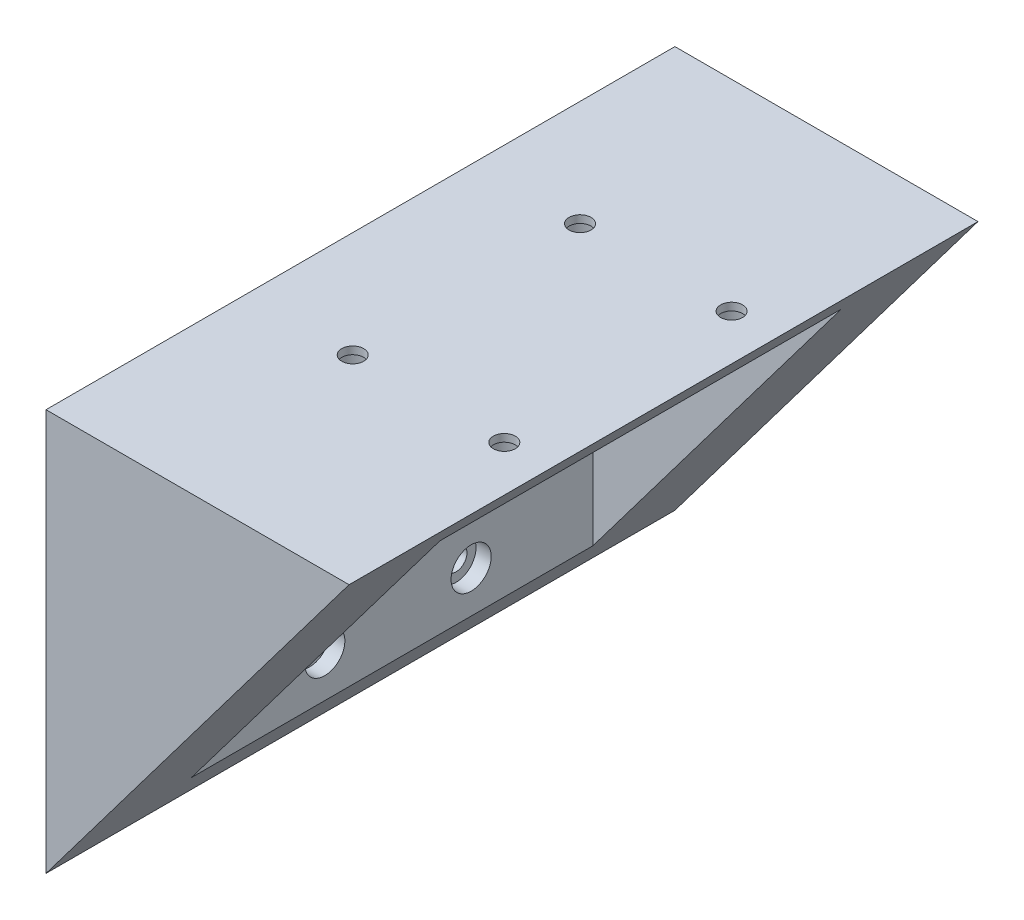
ISO-10303-21;
HEADER;
FILE_DESCRIPTION(('STEP AP214'),'2;1');
FILE_NAME('part.step','',(''),(''),'','','');
FILE_SCHEMA(('AUTOMOTIVE_DESIGN { 1 0 10303 214 1 1 1 1 }'));
ENDSEC;
DATA;
#1=APPLICATION_CONTEXT('core data for automotive mechanical design processes');
#2=APPLICATION_PROTOCOL_DEFINITION('international standard','automotive_design',2000,#1);
#3=PRODUCT_CONTEXT('',#1,'mechanical');
#4=PRODUCT('Part','Part','',(#3));
#5=PRODUCT_RELATED_PRODUCT_CATEGORY('part','',(#4));
#6=PRODUCT_DEFINITION_FORMATION('','',#4);
#7=PRODUCT_DEFINITION_CONTEXT('part definition',#1,'design');
#8=PRODUCT_DEFINITION('design','',#6,#7);
#9=PRODUCT_DEFINITION_SHAPE('','',#8);
#10=(LENGTH_UNIT() NAMED_UNIT(*) SI_UNIT(.MILLI.,.METRE.));
#11=(NAMED_UNIT(*) PLANE_ANGLE_UNIT() SI_UNIT($,.RADIAN.));
#12=(NAMED_UNIT(*) SI_UNIT($,.STERADIAN.) SOLID_ANGLE_UNIT());
#13=UNCERTAINTY_MEASURE_WITH_UNIT(LENGTH_MEASURE(1.E-05),#10,'distance_accuracy_value','');
#14=(GEOMETRIC_REPRESENTATION_CONTEXT(3) GLOBAL_UNCERTAINTY_ASSIGNED_CONTEXT((#13)) GLOBAL_UNIT_ASSIGNED_CONTEXT((#10,
#11,#12)) REPRESENTATION_CONTEXT('',''));
#15=CARTESIAN_POINT('',(0.,0.,0.));
#16=DIRECTION('',(0.,0.,1.));
#17=DIRECTION('',(1.,0.,0.));
#18=AXIS2_PLACEMENT_3D('',#15,#16,#17);
#19=CARTESIAN_POINT('',(33.9811320754717,8.33314479638009,56.5));
#20=DIRECTION('',(0.,-1.,0.));
#21=DIRECTION('',(1.,0.,0.));
#22=AXIS2_PLACEMENT_3D('',#19,#20,#21);
#23=CYLINDRICAL_SURFACE('',#22,1.45);
#24=CARTESIAN_POINT('',(33.9811320754717,2.33314479638009,56.5));
#25=DIRECTION('',(0.,-1.,0.));
#26=DIRECTION('',(0.,0.,-1.));
#27=AXIS2_PLACEMENT_3D('',#24,#25,#26);
#28=CIRCLE('',#27,1.45);
#29=CARTESIAN_POINT('',(33.9811320754717,2.33314479638009,55.05));
#30=VERTEX_POINT('',#29);
#31=EDGE_CURVE('E150',#30,#30,#28,.T.);
#32=ORIENTED_EDGE('',*,*,#31,.F.);
#33=EDGE_LOOP('',(#32));
#34=FACE_BOUND('',#33,.T.);
#35=CARTESIAN_POINT('',(33.9811320754717,1.33314479638009,56.5));
#36=DIRECTION('',(0.,-1.,0.));
#37=DIRECTION('',(1.,0.,0.));
#38=AXIS2_PLACEMENT_3D('',#35,#36,#37);
#39=CIRCLE('',#38,1.45);
#40=CARTESIAN_POINT('',(35.4311320754717,1.33314479638009,56.5));
#41=VERTEX_POINT('',#40);
#42=EDGE_CURVE('E37',#41,#41,#39,.F.);
#43=ORIENTED_EDGE('',*,*,#42,.F.);
#44=EDGE_LOOP('',(#43));
#45=FACE_BOUND('',#44,.T.);
#46=ADVANCED_FACE('F33',(#34,#45),#23,.F.);
#47=CARTESIAN_POINT('',(13.9811320754717,8.33314479638009,56.5));
#48=DIRECTION('',(0.,-1.,0.));
#49=DIRECTION('',(1.,0.,0.));
#50=AXIS2_PLACEMENT_3D('',#47,#48,#49);
#51=CYLINDRICAL_SURFACE('',#50,1.45);
#52=CARTESIAN_POINT('',(13.9811320754717,2.33314479638009,56.5));
#53=DIRECTION('',(0.,-1.,0.));
#54=DIRECTION('',(0.,0.,-1.));
#55=AXIS2_PLACEMENT_3D('',#52,#53,#54);
#56=CIRCLE('',#55,1.45);
#57=CARTESIAN_POINT('',(13.9811320754717,2.33314479638009,55.05));
#58=VERTEX_POINT('',#57);
#59=EDGE_CURVE('E193',#58,#58,#56,.T.);
#60=ORIENTED_EDGE('',*,*,#59,.F.);
#61=EDGE_LOOP('',(#60));
#62=FACE_BOUND('',#61,.T.);
#63=CARTESIAN_POINT('',(13.9811320754717,1.33314479638009,56.5));
#64=DIRECTION('',(0.,-1.,0.));
#65=DIRECTION('',(1.,0.,0.));
#66=AXIS2_PLACEMENT_3D('',#63,#64,#65);
#67=CIRCLE('',#66,1.45);
#68=CARTESIAN_POINT('',(15.4311320754717,1.33314479638009,56.5));
#69=VERTEX_POINT('',#68);
#70=EDGE_CURVE('E157',#69,#69,#67,.F.);
#71=ORIENTED_EDGE('',*,*,#70,.F.);
#72=EDGE_LOOP('',(#71));
#73=FACE_BOUND('',#72,.T.);
#74=ADVANCED_FACE('F234',(#62,#73),#51,.F.);
#75=CARTESIAN_POINT('',(13.9811320754717,8.33314479638009,26.5));
#76=DIRECTION('',(0.,-1.,0.));
#77=DIRECTION('',(1.,0.,0.));
#78=AXIS2_PLACEMENT_3D('',#75,#76,#77);
#79=CYLINDRICAL_SURFACE('',#78,1.45);
#80=CARTESIAN_POINT('',(13.9811320754717,2.33314479638009,26.5));
#81=DIRECTION('',(0.,-1.,0.));
#82=DIRECTION('',(0.,0.,-1.));
#83=AXIS2_PLACEMENT_3D('',#80,#81,#82);
#84=CIRCLE('',#83,1.45);
#85=CARTESIAN_POINT('',(13.9811320754717,2.33314479638009,25.05));
#86=VERTEX_POINT('',#85);
#87=EDGE_CURVE('E196',#86,#86,#84,.T.);
#88=ORIENTED_EDGE('',*,*,#87,.F.);
#89=EDGE_LOOP('',(#88));
#90=FACE_BOUND('',#89,.T.);
#91=CARTESIAN_POINT('',(13.9811320754717,1.33314479638009,26.5));
#92=DIRECTION('',(0.,-1.,0.));
#93=DIRECTION('',(1.,0.,0.));
#94=AXIS2_PLACEMENT_3D('',#91,#92,#93);
#95=CIRCLE('',#94,1.45);
#96=CARTESIAN_POINT('',(15.4311320754717,1.33314479638009,26.5));
#97=VERTEX_POINT('',#96);
#98=EDGE_CURVE('E154',#97,#97,#95,.F.);
#99=ORIENTED_EDGE('',*,*,#98,.F.);
#100=EDGE_LOOP('',(#99));
#101=FACE_BOUND('',#100,.T.);
#102=ADVANCED_FACE('F241',(#90,#101),#79,.F.);
#103=CARTESIAN_POINT('',(33.9811320754717,8.33314479638009,26.5));
#104=DIRECTION('',(0.,-1.,0.));
#105=DIRECTION('',(1.,0.,0.));
#106=AXIS2_PLACEMENT_3D('',#103,#104,#105);
#107=CYLINDRICAL_SURFACE('',#106,1.45);
#108=CARTESIAN_POINT('',(33.9811320754717,2.33314479638009,26.5));
#109=DIRECTION('',(0.,-1.,0.));
#110=DIRECTION('',(0.,0.,-1.));
#111=AXIS2_PLACEMENT_3D('',#108,#109,#110);
#112=CIRCLE('',#111,1.45);
#113=CARTESIAN_POINT('',(33.9811320754717,2.33314479638009,25.05));
#114=VERTEX_POINT('',#113);
#115=EDGE_CURVE('E199',#114,#114,#112,.T.);
#116=ORIENTED_EDGE('',*,*,#115,.F.);
#117=EDGE_LOOP('',(#116));
#118=FACE_BOUND('',#117,.T.);
#119=CARTESIAN_POINT('',(33.9811320754717,1.33314479638009,26.5));
#120=DIRECTION('',(0.,-1.,0.));
#121=DIRECTION('',(1.,0.,0.));
#122=AXIS2_PLACEMENT_3D('',#119,#120,#121);
#123=CIRCLE('',#122,1.45);
#124=CARTESIAN_POINT('',(35.4311320754717,1.33314479638009,26.5));
#125=VERTEX_POINT('',#124);
#126=EDGE_CURVE('E151',#125,#125,#123,.F.);
#127=ORIENTED_EDGE('',*,*,#126,.F.);
#128=EDGE_LOOP('',(#127));
#129=FACE_BOUND('',#128,.T.);
#130=ADVANCED_FACE('F248',(#118,#129),#107,.F.);
#131=CARTESIAN_POINT('',(-5.82641509433961,-28.6868552036199,50.38));
#132=DIRECTION('',(1.,0.,0.));
#133=DIRECTION('',(0.,1.,0.));
#134=AXIS2_PLACEMENT_3D('',#131,#132,#133);
#135=CYLINDRICAL_SURFACE('',#134,1.45);
#136=CARTESIAN_POINT('',(0.,-28.6868552036199,50.38));
#137=DIRECTION('',(1.,0.,0.));
#138=DIRECTION('',(0.,1.,0.));
#139=AXIS2_PLACEMENT_3D('',#136,#137,#138);
#140=CIRCLE('',#139,1.45);
#141=CARTESIAN_POINT('',(0.,-27.2368552036199,50.38));
#142=VERTEX_POINT('',#141);
#143=EDGE_CURVE('E202',#142,#142,#140,.T.);
#144=ORIENTED_EDGE('',*,*,#143,.F.);
#145=EDGE_LOOP('',(#144));
#146=FACE_BOUND('',#145,.T.);
#147=CARTESIAN_POINT('',(2.17358490566039,-28.6868552036199,50.38));
#148=DIRECTION('',(1.,0.,0.));
#149=DIRECTION('',(0.,1.,0.));
#150=AXIS2_PLACEMENT_3D('',#147,#148,#149);
#151=CIRCLE('',#150,1.45);
#152=CARTESIAN_POINT('',(2.17358490566039,-27.2368552036199,50.38));
#153=VERTEX_POINT('',#152);
#154=EDGE_CURVE('E147',#153,#153,#151,.F.);
#155=ORIENTED_EDGE('',*,*,#154,.F.);
#156=EDGE_LOOP('',(#155));
#157=FACE_BOUND('',#156,.T.);
#158=ADVANCED_FACE('F254',(#146,#157),#135,.F.);
#159=CARTESIAN_POINT('',(-5.82641509433961,-39.6368552036199,50.38));
#160=DIRECTION('',(1.,0.,0.));
#161=DIRECTION('',(0.,1.,0.));
#162=AXIS2_PLACEMENT_3D('',#159,#160,#161);
#163=CYLINDRICAL_SURFACE('',#162,1.45);
#164=CARTESIAN_POINT('',(0.,-39.6368552036199,50.38));
#165=DIRECTION('',(1.,0.,0.));
#166=DIRECTION('',(0.,1.,0.));
#167=AXIS2_PLACEMENT_3D('',#164,#165,#166);
#168=CIRCLE('',#167,1.45);
#169=CARTESIAN_POINT('',(0.,-38.1868552036199,50.38));
#170=VERTEX_POINT('',#169);
#171=EDGE_CURVE('E205',#170,#170,#168,.T.);
#172=ORIENTED_EDGE('',*,*,#171,.F.);
#173=EDGE_LOOP('',(#172));
#174=FACE_BOUND('',#173,.T.);
#175=CARTESIAN_POINT('',(2.17358490566039,-39.6368552036199,50.38));
#176=DIRECTION('',(1.,0.,0.));
#177=DIRECTION('',(0.,1.,0.));
#178=AXIS2_PLACEMENT_3D('',#175,#176,#177);
#179=CIRCLE('',#178,1.45);
#180=CARTESIAN_POINT('',(2.17358490566039,-38.1868552036199,50.38));
#181=VERTEX_POINT('',#180);
#182=EDGE_CURVE('E144',#181,#181,#179,.F.);
#183=ORIENTED_EDGE('',*,*,#182,.F.);
#184=EDGE_LOOP('',(#183));
#185=FACE_BOUND('',#184,.T.);
#186=ADVANCED_FACE('F250',(#174,#185),#163,.F.);
#187=CARTESIAN_POINT('',(-5.82641509433961,-39.6368552036199,31.0685809376953));
#188=DIRECTION('',(1.,0.,0.));
#189=DIRECTION('',(0.,1.,0.));
#190=AXIS2_PLACEMENT_3D('',#187,#188,#189);
#191=CYLINDRICAL_SURFACE('',#190,1.45);
#192=CARTESIAN_POINT('',(0.,-39.6368552036199,31.0685809376953));
#193=DIRECTION('',(1.,0.,0.));
#194=DIRECTION('',(0.,1.,0.));
#195=AXIS2_PLACEMENT_3D('',#192,#193,#194);
#196=CIRCLE('',#195,1.45);
#197=CARTESIAN_POINT('',(0.,-38.1868552036199,31.0685809376953));
#198=VERTEX_POINT('',#197);
#199=EDGE_CURVE('E208',#198,#198,#196,.T.);
#200=ORIENTED_EDGE('',*,*,#199,.F.);
#201=EDGE_LOOP('',(#200));
#202=FACE_BOUND('',#201,.T.);
#203=CARTESIAN_POINT('',(2.17358490566039,-39.6368552036199,31.0685809376953));
#204=DIRECTION('',(1.,0.,0.));
#205=DIRECTION('',(0.,1.,0.));
#206=AXIS2_PLACEMENT_3D('',#203,#204,#205);
#207=CIRCLE('',#206,1.45);
#208=CARTESIAN_POINT('',(2.17358490566039,-38.1868552036199,31.0685809376953));
#209=VERTEX_POINT('',#208);
#210=EDGE_CURVE('E140',#209,#209,#207,.F.);
#211=ORIENTED_EDGE('',*,*,#210,.F.);
#212=EDGE_LOOP('',(#211));
#213=FACE_BOUND('',#212,.T.);
#214=ADVANCED_FACE('F253',(#202,#213),#191,.F.);
#215=CARTESIAN_POINT('',(-5.82641509433961,-28.6868552036199,31.0685809376953));
#216=DIRECTION('',(1.,0.,0.));
#217=DIRECTION('',(0.,1.,0.));
#218=AXIS2_PLACEMENT_3D('',#215,#216,#217);
#219=CYLINDRICAL_SURFACE('',#218,1.45);
#220=CARTESIAN_POINT('',(0.,-28.6868552036199,31.0685809376953));
#221=DIRECTION('',(1.,0.,0.));
#222=DIRECTION('',(0.,1.,0.));
#223=AXIS2_PLACEMENT_3D('',#220,#221,#222);
#224=CIRCLE('',#223,1.45);
#225=CARTESIAN_POINT('',(0.,-27.2368552036199,31.0685809376953));
#226=VERTEX_POINT('',#225);
#227=EDGE_CURVE('E211',#226,#226,#224,.T.);
#228=ORIENTED_EDGE('',*,*,#227,.F.);
#229=EDGE_LOOP('',(#228));
#230=FACE_BOUND('',#229,.T.);
#231=CARTESIAN_POINT('',(2.17358490566039,-28.6868552036199,31.0685809376953));
#232=DIRECTION('',(1.,0.,0.));
#233=DIRECTION('',(0.,1.,0.));
#234=AXIS2_PLACEMENT_3D('',#231,#232,#233);
#235=CIRCLE('',#234,1.45);
#236=CARTESIAN_POINT('',(2.17358490566039,-27.2368552036199,31.0685809376953));
#237=VERTEX_POINT('',#236);
#238=EDGE_CURVE('E137',#237,#237,#235,.F.);
#239=ORIENTED_EDGE('',*,*,#238,.F.);
#240=EDGE_LOOP('',(#239));
#241=FACE_BOUND('',#240,.T.);
#242=ADVANCED_FACE('F258',(#230,#241),#219,.F.);
#243=CARTESIAN_POINT('',(40.,2.33314479638009,83.));
#244=DIRECTION('',(-0.798189150333231,0.602406905911872,0.));
#245=DIRECTION('',(-0.602406905911872,-0.798189150333231,0.));
#246=AXIS2_PLACEMENT_3D('',#243,#244,#245);
#247=PLANE('',#246);
#248=DIRECTION('',(0.602406905911872,0.798189150333231,0.));
#249=VECTOR('',#248,1.);
#250=CARTESIAN_POINT('',(40.,2.33314479638009,0.));
#251=LINE('',#250,#249);
#252=CARTESIAN_POINT('',(0.,-50.6668552036199,0.));
#253=VERTEX_POINT('',#252);
#254=CARTESIAN_POINT('',(40.,2.33314479638009,0.));
#255=VERTEX_POINT('',#254);
#256=EDGE_CURVE('E76',#253,#255,#251,.T.);
#257=ORIENTED_EDGE('',*,*,#256,.T.);
#258=DIRECTION('',(0.,0.,-1.));
#259=VECTOR('',#258,1.);
#260=CARTESIAN_POINT('',(40.,2.33314479638009,83.));
#261=LINE('',#260,#259);
#262=CARTESIAN_POINT('',(40.,2.33314479638009,83.));
#263=VERTEX_POINT('',#262);
#264=EDGE_CURVE('E128',#263,#255,#261,.T.);
#265=ORIENTED_EDGE('',*,*,#264,.F.);
#266=DIRECTION('',(0.602406905911872,0.798189150333231,0.));
#267=VECTOR('',#266,1.);
#268=CARTESIAN_POINT('',(40.,2.33314479638009,83.));
#269=LINE('',#268,#267);
#270=CARTESIAN_POINT('',(0.,-50.6668552036199,83.));
#271=VERTEX_POINT('',#270);
#272=EDGE_CURVE('E59',#271,#263,#269,.T.);
#273=ORIENTED_EDGE('',*,*,#272,.F.);
#274=DIRECTION('',(0.,0.,-1.));
#275=VECTOR('',#274,1.);
#276=CARTESIAN_POINT('',(0.,-50.6668552036199,83.));
#277=LINE('',#276,#275);
#278=EDGE_CURVE('E42',#271,#253,#277,.T.);
#279=ORIENTED_EDGE('',*,*,#278,.T.);
#280=EDGE_LOOP('',(#257,#265,#273,#279));
#281=FACE_BOUND('',#280,.T.);
#282=DIRECTION('',(0.602406905911872,0.798189150333231,0.));
#283=VECTOR('',#282,1.);
#284=CARTESIAN_POINT('',(4.17358490566039,-45.1368552036199,15.));
#285=LINE('',#284,#283);
#286=CARTESIAN_POINT('',(4.17358490566039,-45.1368552036199,15.));
#287=VERTEX_POINT('',#286);
#288=CARTESIAN_POINT('',(36.9811320754717,-1.66685520361991,15.));
#289=VERTEX_POINT('',#288);
#290=EDGE_CURVE('E108',#287,#289,#285,.T.);
#291=ORIENTED_EDGE('',*,*,#290,.F.);
#292=DIRECTION('',(0.,0.,1.));
#293=VECTOR('',#292,1.);
#294=CARTESIAN_POINT('',(4.17358490566039,-45.1368552036199,15.));
#295=LINE('',#294,#293);
#296=CARTESIAN_POINT('',(4.17358490566039,-45.1368552036199,68.));
#297=VERTEX_POINT('',#296);
#298=EDGE_CURVE('E119',#287,#297,#295,.T.);
#299=ORIENTED_EDGE('',*,*,#298,.T.);
#300=DIRECTION('',(0.602406905911872,0.798189150333231,0.));
#301=VECTOR('',#300,1.);
#302=CARTESIAN_POINT('',(4.17358490566039,-45.1368552036199,68.));
#303=LINE('',#302,#301);
#304=CARTESIAN_POINT('',(36.9811320754717,-1.66685520361991,68.));
#305=VERTEX_POINT('',#304);
#306=EDGE_CURVE('E117',#297,#305,#303,.T.);
#307=ORIENTED_EDGE('',*,*,#306,.T.);
#308=DIRECTION('',(0.,0.,1.));
#309=VECTOR('',#308,1.);
#310=CARTESIAN_POINT('',(36.9811320754717,-1.66685520361991,15.));
#311=LINE('',#310,#309);
#312=EDGE_CURVE('E101',#289,#305,#311,.T.);
#313=ORIENTED_EDGE('',*,*,#312,.F.);
#314=EDGE_LOOP('',(#291,#299,#307,#313));
#315=FACE_BOUND('',#314,.T.);
#316=ADVANCED_FACE('F116',(#281,#315),#247,.F.);
#317=CARTESIAN_POINT('',(0.,2.33314479638009,83.));
#318=DIRECTION('',(0.,-1.,0.));
#319=DIRECTION('',(0.,0.,-1.));
#320=AXIS2_PLACEMENT_3D('',#317,#318,#319);
#321=PLANE('',#320);
#322=ORIENTED_EDGE('',*,*,#115,.T.);
#323=EDGE_LOOP('',(#322));
#324=FACE_BOUND('',#323,.T.);
#325=ORIENTED_EDGE('',*,*,#87,.T.);
#326=EDGE_LOOP('',(#325));
#327=FACE_BOUND('',#326,.T.);
#328=ORIENTED_EDGE('',*,*,#59,.T.);
#329=EDGE_LOOP('',(#328));
#330=FACE_BOUND('',#329,.T.);
#331=ORIENTED_EDGE('',*,*,#31,.T.);
#332=EDGE_LOOP('',(#331));
#333=FACE_BOUND('',#332,.T.);
#334=DIRECTION('',(-1.,0.,0.));
#335=VECTOR('',#334,1.);
#336=CARTESIAN_POINT('',(0.,2.33314479638009,0.));
#337=LINE('',#336,#335);
#338=CARTESIAN_POINT('',(0.,2.33314479638009,0.));
#339=VERTEX_POINT('',#338);
#340=EDGE_CURVE('E129',#255,#339,#337,.T.);
#341=ORIENTED_EDGE('',*,*,#340,.T.);
#342=DIRECTION('',(0.,0.,-1.));
#343=VECTOR('',#342,1.);
#344=CARTESIAN_POINT('',(0.,2.33314479638009,83.));
#345=LINE('',#344,#343);
#346=CARTESIAN_POINT('',(0.,2.33314479638009,83.));
#347=VERTEX_POINT('',#346);
#348=EDGE_CURVE('E11',#347,#339,#345,.T.);
#349=ORIENTED_EDGE('',*,*,#348,.F.);
#350=DIRECTION('',(-1.,0.,0.));
#351=VECTOR('',#350,1.);
#352=CARTESIAN_POINT('',(0.,2.33314479638009,83.));
#353=LINE('',#352,#351);
#354=EDGE_CURVE('E124',#263,#347,#353,.T.);
#355=ORIENTED_EDGE('',*,*,#354,.F.);
#356=ORIENTED_EDGE('',*,*,#264,.T.);
#357=EDGE_LOOP('',(#341,#349,#355,#356));
#358=FACE_BOUND('',#357,.T.);
#359=ADVANCED_FACE('F35',(#324,#327,#330,#333,#358),#321,.F.);
#360=CARTESIAN_POINT('',(0.,2.33314479638009,83.));
#361=DIRECTION('',(1.,0.,0.));
#362=DIRECTION('',(0.,1.,0.));
#363=AXIS2_PLACEMENT_3D('',#360,#361,#362);
#364=PLANE('',#363);
#365=ORIENTED_EDGE('',*,*,#227,.T.);
#366=EDGE_LOOP('',(#365));
#367=FACE_BOUND('',#366,.T.);
#368=ORIENTED_EDGE('',*,*,#199,.T.);
#369=EDGE_LOOP('',(#368));
#370=FACE_BOUND('',#369,.T.);
#371=ORIENTED_EDGE('',*,*,#171,.T.);
#372=EDGE_LOOP('',(#371));
#373=FACE_BOUND('',#372,.T.);
#374=ORIENTED_EDGE('',*,*,#143,.T.);
#375=EDGE_LOOP('',(#374));
#376=FACE_BOUND('',#375,.T.);
#377=DIRECTION('',(0.,-1.,0.));
#378=VECTOR('',#377,1.);
#379=CARTESIAN_POINT('',(0.,2.33314479638009,0.));
#380=LINE('',#379,#378);
#381=EDGE_CURVE('E132',#339,#253,#380,.T.);
#382=ORIENTED_EDGE('',*,*,#381,.T.);
#383=ORIENTED_EDGE('',*,*,#278,.F.);
#384=DIRECTION('',(0.,-1.,0.));
#385=VECTOR('',#384,1.);
#386=CARTESIAN_POINT('',(0.,2.33314479638009,83.));
#387=LINE('',#386,#385);
#388=EDGE_CURVE('E81',#347,#271,#387,.T.);
#389=ORIENTED_EDGE('',*,*,#388,.F.);
#390=ORIENTED_EDGE('',*,*,#348,.T.);
#391=EDGE_LOOP('',(#382,#383,#389,#390));
#392=FACE_BOUND('',#391,.T.);
#393=ADVANCED_FACE('F368',(#367,#370,#373,#376,#392),#364,.F.);
#394=CARTESIAN_POINT('',(0.,0.,83.));
#395=DIRECTION('',(0.,0.,-1.));
#396=DIRECTION('',(-1.,0.,0.));
#397=AXIS2_PLACEMENT_3D('',#394,#395,#396);
#398=PLANE('',#397);
#399=ORIENTED_EDGE('',*,*,#354,.T.);
#400=ORIENTED_EDGE('',*,*,#388,.T.);
#401=ORIENTED_EDGE('',*,*,#272,.T.);
#402=EDGE_LOOP('',(#399,#400,#401));
#403=FACE_BOUND('',#402,.T.);
#404=ADVANCED_FACE('F362',(#403),#398,.F.);
#405=CARTESIAN_POINT('',(0.,0.,0.));
#406=DIRECTION('',(0.,0.,-1.));
#407=DIRECTION('',(-1.,0.,0.));
#408=AXIS2_PLACEMENT_3D('',#405,#406,#407);
#409=PLANE('',#408);
#410=ORIENTED_EDGE('',*,*,#340,.F.);
#411=ORIENTED_EDGE('',*,*,#256,.F.);
#412=ORIENTED_EDGE('',*,*,#381,.F.);
#413=EDGE_LOOP('',(#410,#411,#412));
#414=FACE_BOUND('',#413,.T.);
#415=ADVANCED_FACE('F350',(#414),#409,.T.);
#416=CARTESIAN_POINT('',(4.17358490566038,-1.66685520361991,15.));
#417=DIRECTION('',(-1.,0.,0.));
#418=DIRECTION('',(0.,-1.,0.));
#419=AXIS2_PLACEMENT_3D('',#416,#417,#418);
#420=PLANE('',#419);
#421=CARTESIAN_POINT('',(4.17358490566039,-28.6868552036199,31.0685809376953));
#422=DIRECTION('',(1.,0.,0.));
#423=DIRECTION('',(0.,1.,0.));
#424=AXIS2_PLACEMENT_3D('',#421,#422,#423);
#425=CIRCLE('',#424,2.65);
#426=CARTESIAN_POINT('',(4.17358490566039,-26.0368552036199,31.0685809376953));
#427=VERTEX_POINT('',#426);
#428=EDGE_CURVE('E179',#427,#427,#425,.T.);
#429=ORIENTED_EDGE('',*,*,#428,.F.);
#430=EDGE_LOOP('',(#429));
#431=FACE_BOUND('',#430,.T.);
#432=CARTESIAN_POINT('',(4.17358490566039,-39.6368552036199,50.38));
#433=DIRECTION('',(1.,0.,0.));
#434=DIRECTION('',(0.,1.,0.));
#435=AXIS2_PLACEMENT_3D('',#432,#433,#434);
#436=CIRCLE('',#435,2.65);
#437=CARTESIAN_POINT('',(4.17358490566039,-36.9868552036199,50.38));
#438=VERTEX_POINT('',#437);
#439=EDGE_CURVE('E171',#438,#438,#436,.T.);
#440=ORIENTED_EDGE('',*,*,#439,.F.);
#441=EDGE_LOOP('',(#440));
#442=FACE_BOUND('',#441,.T.);
#443=CARTESIAN_POINT('',(4.17358490566039,-39.6368552036199,31.0685809376953));
#444=DIRECTION('',(1.,0.,0.));
#445=DIRECTION('',(0.,1.,0.));
#446=AXIS2_PLACEMENT_3D('',#443,#444,#445);
#447=CIRCLE('',#446,2.65);
#448=CARTESIAN_POINT('',(4.17358490566039,-36.9868552036199,31.0685809376953));
#449=VERTEX_POINT('',#448);
#450=EDGE_CURVE('E162',#449,#449,#447,.T.);
#451=ORIENTED_EDGE('',*,*,#450,.F.);
#452=EDGE_LOOP('',(#451));
#453=FACE_BOUND('',#452,.T.);
#454=CARTESIAN_POINT('',(4.17358490566039,-28.6868552036199,50.38));
#455=DIRECTION('',(1.,0.,0.));
#456=DIRECTION('',(0.,1.,0.));
#457=AXIS2_PLACEMENT_3D('',#454,#455,#456);
#458=CIRCLE('',#457,2.65);
#459=CARTESIAN_POINT('',(4.17358490566039,-26.0368552036199,50.38));
#460=VERTEX_POINT('',#459);
#461=EDGE_CURVE('E178',#460,#460,#458,.T.);
#462=ORIENTED_EDGE('',*,*,#461,.F.);
#463=EDGE_LOOP('',(#462));
#464=FACE_BOUND('',#463,.T.);
#465=DIRECTION('',(0.,-1.,0.));
#466=VECTOR('',#465,1.);
#467=CARTESIAN_POINT('',(4.17358490566038,-1.66685520361991,68.));
#468=LINE('',#467,#466);
#469=CARTESIAN_POINT('',(4.17358490566038,-1.66685520361991,68.));
#470=VERTEX_POINT('',#469);
#471=EDGE_CURVE('E114',#470,#297,#468,.T.);
#472=ORIENTED_EDGE('',*,*,#471,.T.);
#473=ORIENTED_EDGE('',*,*,#298,.F.);
#474=DIRECTION('',(0.,-1.,0.));
#475=VECTOR('',#474,1.);
#476=CARTESIAN_POINT('',(4.17358490566038,-1.66685520361991,15.));
#477=LINE('',#476,#475);
#478=CARTESIAN_POINT('',(4.17358490566038,-1.66685520361991,15.));
#479=VERTEX_POINT('',#478);
#480=EDGE_CURVE('E107',#479,#287,#477,.T.);
#481=ORIENTED_EDGE('',*,*,#480,.F.);
#482=DIRECTION('',(0.,0.,1.));
#483=VECTOR('',#482,1.);
#484=CARTESIAN_POINT('',(4.17358490566038,-1.66685520361991,15.));
#485=LINE('',#484,#483);
#486=EDGE_CURVE('E103',#479,#470,#485,.T.);
#487=ORIENTED_EDGE('',*,*,#486,.T.);
#488=EDGE_LOOP('',(#472,#473,#481,#487));
#489=FACE_BOUND('',#488,.T.);
#490=ADVANCED_FACE('F218',(#431,#442,#453,#464,#489),#420,.F.);
#491=CARTESIAN_POINT('',(36.9811320754717,-1.66685520361991,15.));
#492=DIRECTION('',(0.,1.,0.));
#493=DIRECTION('',(-1.,0.,0.));
#494=AXIS2_PLACEMENT_3D('',#491,#492,#493);
#495=PLANE('',#494);
#496=CARTESIAN_POINT('',(33.9811320754717,-1.66685520361991,56.5));
#497=DIRECTION('',(0.,-1.,0.));
#498=DIRECTION('',(1.,0.,0.));
#499=AXIS2_PLACEMENT_3D('',#496,#497,#498);
#500=CIRCLE('',#499,2.8);
#501=CARTESIAN_POINT('',(36.7811320754717,-1.66685520361991,56.5));
#502=VERTEX_POINT('',#501);
#503=EDGE_CURVE('E419',#502,#502,#500,.T.);
#504=ORIENTED_EDGE('',*,*,#503,.F.);
#505=EDGE_LOOP('',(#504));
#506=FACE_BOUND('',#505,.T.);
#507=CARTESIAN_POINT('',(13.9811320754717,-1.66685520361991,26.5));
#508=DIRECTION('',(0.,-1.,0.));
#509=DIRECTION('',(1.,0.,0.));
#510=AXIS2_PLACEMENT_3D('',#507,#508,#509);
#511=CIRCLE('',#510,2.8);
#512=CARTESIAN_POINT('',(16.7811320754717,-1.66685520361991,26.5));
#513=VERTEX_POINT('',#512);
#514=EDGE_CURVE('E430',#513,#513,#511,.T.);
#515=ORIENTED_EDGE('',*,*,#514,.F.);
#516=EDGE_LOOP('',(#515));
#517=FACE_BOUND('',#516,.T.);
#518=CARTESIAN_POINT('',(33.9811320754717,-1.66685520361991,26.5));
#519=DIRECTION('',(0.,-1.,0.));
#520=DIRECTION('',(1.,0.,0.));
#521=AXIS2_PLACEMENT_3D('',#518,#519,#520);
#522=CIRCLE('',#521,2.8);
#523=CARTESIAN_POINT('',(36.7811320754717,-1.66685520361991,26.5));
#524=VERTEX_POINT('',#523);
#525=EDGE_CURVE('E426',#524,#524,#522,.T.);
#526=ORIENTED_EDGE('',*,*,#525,.F.);
#527=EDGE_LOOP('',(#526));
#528=FACE_BOUND('',#527,.T.);
#529=CARTESIAN_POINT('',(13.9811320754717,-1.66685520361991,56.5));
#530=DIRECTION('',(0.,-1.,0.));
#531=DIRECTION('',(1.,0.,0.));
#532=AXIS2_PLACEMENT_3D('',#529,#530,#531);
#533=CIRCLE('',#532,2.8);
#534=CARTESIAN_POINT('',(16.7811320754717,-1.66685520361991,56.5));
#535=VERTEX_POINT('',#534);
#536=EDGE_CURVE('E418',#535,#535,#533,.T.);
#537=ORIENTED_EDGE('',*,*,#536,.F.);
#538=EDGE_LOOP('',(#537));
#539=FACE_BOUND('',#538,.T.);
#540=DIRECTION('',(-1.,0.,0.));
#541=VECTOR('',#540,1.);
#542=CARTESIAN_POINT('',(36.9811320754717,-1.66685520361991,68.));
#543=LINE('',#542,#541);
#544=EDGE_CURVE('E50',#305,#470,#543,.T.);
#545=ORIENTED_EDGE('',*,*,#544,.T.);
#546=ORIENTED_EDGE('',*,*,#486,.F.);
#547=DIRECTION('',(-1.,0.,0.));
#548=VECTOR('',#547,1.);
#549=CARTESIAN_POINT('',(36.9811320754717,-1.66685520361991,15.));
#550=LINE('',#549,#548);
#551=EDGE_CURVE('E97',#289,#479,#550,.T.);
#552=ORIENTED_EDGE('',*,*,#551,.F.);
#553=ORIENTED_EDGE('',*,*,#312,.T.);
#554=EDGE_LOOP('',(#545,#546,#552,#553));
#555=FACE_BOUND('',#554,.T.);
#556=ADVANCED_FACE('F99',(#506,#517,#528,#539,#555),#495,.F.);
#557=CARTESIAN_POINT('',(0.,0.,15.));
#558=DIRECTION('',(0.,0.,1.));
#559=DIRECTION('',(1.,0.,0.));
#560=AXIS2_PLACEMENT_3D('',#557,#558,#559);
#561=PLANE('',#560);
#562=ORIENTED_EDGE('',*,*,#290,.T.);
#563=ORIENTED_EDGE('',*,*,#551,.T.);
#564=ORIENTED_EDGE('',*,*,#480,.T.);
#565=EDGE_LOOP('',(#562,#563,#564));
#566=FACE_BOUND('',#565,.T.);
#567=ADVANCED_FACE('F111',(#566),#561,.T.);
#568=CARTESIAN_POINT('',(0.,0.,68.));
#569=DIRECTION('',(0.,0.,1.));
#570=DIRECTION('',(1.,0.,0.));
#571=AXIS2_PLACEMENT_3D('',#568,#569,#570);
#572=PLANE('',#571);
#573=ORIENTED_EDGE('',*,*,#306,.F.);
#574=ORIENTED_EDGE('',*,*,#471,.F.);
#575=ORIENTED_EDGE('',*,*,#544,.F.);
#576=EDGE_LOOP('',(#573,#574,#575));
#577=FACE_BOUND('',#576,.T.);
#578=ADVANCED_FACE('F219',(#577),#572,.F.);
#579=CARTESIAN_POINT('',(2.17358490566039,-28.6868552036199,31.0685809376953));
#580=DIRECTION('',(1.,0.,0.));
#581=DIRECTION('',(0.,1.,0.));
#582=AXIS2_PLACEMENT_3D('',#579,#580,#581);
#583=PLANE('',#582);
#584=CARTESIAN_POINT('',(2.17358490566039,-28.6868552036199,31.0685809376953));
#585=DIRECTION('',(1.,0.,0.));
#586=DIRECTION('',(0.,1.,0.));
#587=AXIS2_PLACEMENT_3D('',#584,#585,#586);
#588=CIRCLE('',#587,2.65);
#589=CARTESIAN_POINT('',(2.17358490566039,-26.0368552036199,31.0685809376953));
#590=VERTEX_POINT('',#589);
#591=EDGE_CURVE('E175',#590,#590,#588,.T.);
#592=ORIENTED_EDGE('',*,*,#591,.T.);
#593=EDGE_LOOP('',(#592));
#594=FACE_BOUND('',#593,.T.);
#595=ORIENTED_EDGE('',*,*,#238,.T.);
#596=EDGE_LOOP('',(#595));
#597=FACE_BOUND('',#596,.T.);
#598=ADVANCED_FACE('F221',(#594,#597),#583,.T.);
#599=CARTESIAN_POINT('',(2.17358490566039,-28.6868552036199,31.0685809376953));
#600=DIRECTION('',(1.,0.,0.));
#601=DIRECTION('',(0.,1.,0.));
#602=AXIS2_PLACEMENT_3D('',#599,#600,#601);
#603=CYLINDRICAL_SURFACE('',#602,2.65);
#604=ORIENTED_EDGE('',*,*,#591,.F.);
#605=EDGE_LOOP('',(#604));
#606=FACE_BOUND('',#605,.T.);
#607=ORIENTED_EDGE('',*,*,#428,.T.);
#608=EDGE_LOOP('',(#607));
#609=FACE_BOUND('',#608,.T.);
#610=ADVANCED_FACE('F228',(#606,#609),#603,.F.);
#611=CARTESIAN_POINT('',(2.17358490566039,-39.6368552036199,31.0685809376953));
#612=DIRECTION('',(1.,0.,0.));
#613=DIRECTION('',(0.,1.,0.));
#614=AXIS2_PLACEMENT_3D('',#611,#612,#613);
#615=PLANE('',#614);
#616=CARTESIAN_POINT('',(2.17358490566039,-39.6368552036199,31.0685809376953));
#617=DIRECTION('',(1.,0.,0.));
#618=DIRECTION('',(0.,1.,0.));
#619=AXIS2_PLACEMENT_3D('',#616,#617,#618);
#620=CIRCLE('',#619,2.65);
#621=CARTESIAN_POINT('',(2.17358490566039,-36.9868552036199,31.0685809376953));
#622=VERTEX_POINT('',#621);
#623=EDGE_CURVE('E166',#622,#622,#620,.T.);
#624=ORIENTED_EDGE('',*,*,#623,.T.);
#625=EDGE_LOOP('',(#624));
#626=FACE_BOUND('',#625,.T.);
#627=ORIENTED_EDGE('',*,*,#210,.T.);
#628=EDGE_LOOP('',(#627));
#629=FACE_BOUND('',#628,.T.);
#630=ADVANCED_FACE('F327',(#626,#629),#615,.T.);
#631=CARTESIAN_POINT('',(2.17358490566039,-39.6368552036199,31.0685809376953));
#632=DIRECTION('',(1.,0.,0.));
#633=DIRECTION('',(0.,1.,0.));
#634=AXIS2_PLACEMENT_3D('',#631,#632,#633);
#635=CYLINDRICAL_SURFACE('',#634,2.65);
#636=ORIENTED_EDGE('',*,*,#623,.F.);
#637=EDGE_LOOP('',(#636));
#638=FACE_BOUND('',#637,.T.);
#639=ORIENTED_EDGE('',*,*,#450,.T.);
#640=EDGE_LOOP('',(#639));
#641=FACE_BOUND('',#640,.T.);
#642=ADVANCED_FACE('F330',(#638,#641),#635,.F.);
#643=CARTESIAN_POINT('',(2.17358490566039,-39.6368552036199,50.38));
#644=DIRECTION('',(1.,0.,0.));
#645=DIRECTION('',(0.,1.,0.));
#646=AXIS2_PLACEMENT_3D('',#643,#644,#645);
#647=PLANE('',#646);
#648=CARTESIAN_POINT('',(2.17358490566039,-39.6368552036199,50.38));
#649=DIRECTION('',(1.,0.,0.));
#650=DIRECTION('',(0.,1.,0.));
#651=AXIS2_PLACEMENT_3D('',#648,#649,#650);
#652=CIRCLE('',#651,2.65);
#653=CARTESIAN_POINT('',(2.17358490566039,-36.9868552036199,50.38));
#654=VERTEX_POINT('',#653);
#655=EDGE_CURVE('E182',#654,#654,#652,.T.);
#656=ORIENTED_EDGE('',*,*,#655,.T.);
#657=EDGE_LOOP('',(#656));
#658=FACE_BOUND('',#657,.T.);
#659=ORIENTED_EDGE('',*,*,#182,.T.);
#660=EDGE_LOOP('',(#659));
#661=FACE_BOUND('',#660,.T.);
#662=ADVANCED_FACE('F287',(#658,#661),#647,.T.);
#663=CARTESIAN_POINT('',(2.17358490566039,-39.6368552036199,50.38));
#664=DIRECTION('',(1.,0.,0.));
#665=DIRECTION('',(0.,1.,0.));
#666=AXIS2_PLACEMENT_3D('',#663,#664,#665);
#667=CYLINDRICAL_SURFACE('',#666,2.65);
#668=ORIENTED_EDGE('',*,*,#655,.F.);
#669=EDGE_LOOP('',(#668));
#670=FACE_BOUND('',#669,.T.);
#671=ORIENTED_EDGE('',*,*,#439,.T.);
#672=EDGE_LOOP('',(#671));
#673=FACE_BOUND('',#672,.T.);
#674=ADVANCED_FACE('F277',(#670,#673),#667,.F.);
#675=CARTESIAN_POINT('',(2.17358490566039,-28.6868552036199,50.38));
#676=DIRECTION('',(1.,0.,0.));
#677=DIRECTION('',(0.,1.,0.));
#678=AXIS2_PLACEMENT_3D('',#675,#676,#677);
#679=PLANE('',#678);
#680=CARTESIAN_POINT('',(2.17358490566039,-28.6868552036199,50.38));
#681=DIRECTION('',(1.,0.,0.));
#682=DIRECTION('',(0.,1.,0.));
#683=AXIS2_PLACEMENT_3D('',#680,#681,#682);
#684=CIRCLE('',#683,2.65);
#685=CARTESIAN_POINT('',(2.17358490566039,-26.0368552036199,50.38));
#686=VERTEX_POINT('',#685);
#687=EDGE_CURVE('E141',#686,#686,#684,.T.);
#688=ORIENTED_EDGE('',*,*,#687,.T.);
#689=EDGE_LOOP('',(#688));
#690=FACE_BOUND('',#689,.T.);
#691=ORIENTED_EDGE('',*,*,#154,.T.);
#692=EDGE_LOOP('',(#691));
#693=FACE_BOUND('',#692,.T.);
#694=ADVANCED_FACE('F274',(#690,#693),#679,.T.);
#695=CARTESIAN_POINT('',(2.17358490566039,-28.6868552036199,50.38));
#696=DIRECTION('',(1.,0.,0.));
#697=DIRECTION('',(0.,1.,0.));
#698=AXIS2_PLACEMENT_3D('',#695,#696,#697);
#699=CYLINDRICAL_SURFACE('',#698,2.65);
#700=ORIENTED_EDGE('',*,*,#687,.F.);
#701=EDGE_LOOP('',(#700));
#702=FACE_BOUND('',#701,.T.);
#703=ORIENTED_EDGE('',*,*,#461,.T.);
#704=EDGE_LOOP('',(#703));
#705=FACE_BOUND('',#704,.T.);
#706=ADVANCED_FACE('F276',(#702,#705),#699,.F.);
#707=CARTESIAN_POINT('',(33.9811320754717,1.33314479638009,26.5));
#708=DIRECTION('',(0.,-1.,0.));
#709=DIRECTION('',(1.,0.,0.));
#710=AXIS2_PLACEMENT_3D('',#707,#708,#709);
#711=PLANE('',#710);
#712=CARTESIAN_POINT('',(33.9811320754717,1.33314479638009,26.5));
#713=DIRECTION('',(0.,-1.,0.));
#714=DIRECTION('',(1.,0.,0.));
#715=AXIS2_PLACEMENT_3D('',#712,#713,#714);
#716=CIRCLE('',#715,2.8);
#717=CARTESIAN_POINT('',(36.7811320754717,1.33314479638009,26.5));
#718=VERTEX_POINT('',#717);
#719=EDGE_CURVE('E433',#718,#718,#716,.T.);
#720=ORIENTED_EDGE('',*,*,#719,.T.);
#721=EDGE_LOOP('',(#720));
#722=FACE_BOUND('',#721,.T.);
#723=ORIENTED_EDGE('',*,*,#126,.T.);
#724=EDGE_LOOP('',(#723));
#725=FACE_BOUND('',#724,.T.);
#726=ADVANCED_FACE('F284',(#722,#725),#711,.T.);
#727=CARTESIAN_POINT('',(33.9811320754717,1.33314479638009,26.5));
#728=DIRECTION('',(0.,-1.,0.));
#729=DIRECTION('',(1.,0.,0.));
#730=AXIS2_PLACEMENT_3D('',#727,#728,#729);
#731=CYLINDRICAL_SURFACE('',#730,2.8);
#732=ORIENTED_EDGE('',*,*,#719,.F.);
#733=EDGE_LOOP('',(#732));
#734=FACE_BOUND('',#733,.T.);
#735=ORIENTED_EDGE('',*,*,#525,.T.);
#736=EDGE_LOOP('',(#735));
#737=FACE_BOUND('',#736,.T.);
#738=ADVANCED_FACE('F302',(#734,#737),#731,.F.);
#739=CARTESIAN_POINT('',(13.9811320754717,1.33314479638009,26.5));
#740=DIRECTION('',(0.,-1.,0.));
#741=DIRECTION('',(1.,0.,0.));
#742=AXIS2_PLACEMENT_3D('',#739,#740,#741);
#743=PLANE('',#742);
#744=CARTESIAN_POINT('',(13.9811320754717,1.33314479638009,26.5));
#745=DIRECTION('',(0.,-1.,0.));
#746=DIRECTION('',(1.,0.,0.));
#747=AXIS2_PLACEMENT_3D('',#744,#745,#746);
#748=CIRCLE('',#747,2.8);
#749=CARTESIAN_POINT('',(16.7811320754717,1.33314479638009,26.5));
#750=VERTEX_POINT('',#749);
#751=EDGE_CURVE('E423',#750,#750,#748,.T.);
#752=ORIENTED_EDGE('',*,*,#751,.T.);
#753=EDGE_LOOP('',(#752));
#754=FACE_BOUND('',#753,.T.);
#755=ORIENTED_EDGE('',*,*,#98,.T.);
#756=EDGE_LOOP('',(#755));
#757=FACE_BOUND('',#756,.T.);
#758=ADVANCED_FACE('F299',(#754,#757),#743,.T.);
#759=CARTESIAN_POINT('',(13.9811320754717,1.33314479638009,26.5));
#760=DIRECTION('',(0.,-1.,0.));
#761=DIRECTION('',(1.,0.,0.));
#762=AXIS2_PLACEMENT_3D('',#759,#760,#761);
#763=CYLINDRICAL_SURFACE('',#762,2.8);
#764=ORIENTED_EDGE('',*,*,#751,.F.);
#765=EDGE_LOOP('',(#764));
#766=FACE_BOUND('',#765,.T.);
#767=ORIENTED_EDGE('',*,*,#514,.T.);
#768=EDGE_LOOP('',(#767));
#769=FACE_BOUND('',#768,.T.);
#770=ADVANCED_FACE('F301',(#766,#769),#763,.F.);
#771=CARTESIAN_POINT('',(13.9811320754717,1.33314479638009,56.5));
#772=DIRECTION('',(0.,-1.,0.));
#773=DIRECTION('',(1.,0.,0.));
#774=AXIS2_PLACEMENT_3D('',#771,#772,#773);
#775=PLANE('',#774);
#776=CARTESIAN_POINT('',(13.9811320754717,1.33314479638009,56.5));
#777=DIRECTION('',(0.,-1.,0.));
#778=DIRECTION('',(1.,0.,0.));
#779=AXIS2_PLACEMENT_3D('',#776,#777,#778);
#780=CIRCLE('',#779,2.8);
#781=CARTESIAN_POINT('',(16.7811320754717,1.33314479638009,56.5));
#782=VERTEX_POINT('',#781);
#783=EDGE_CURVE('E155',#782,#782,#780,.T.);
#784=ORIENTED_EDGE('',*,*,#783,.T.);
#785=EDGE_LOOP('',(#784));
#786=FACE_BOUND('',#785,.T.);
#787=ORIENTED_EDGE('',*,*,#70,.T.);
#788=EDGE_LOOP('',(#787));
#789=FACE_BOUND('',#788,.T.);
#790=ADVANCED_FACE('F309',(#786,#789),#775,.T.);
#791=CARTESIAN_POINT('',(13.9811320754717,1.33314479638009,56.5));
#792=DIRECTION('',(0.,-1.,0.));
#793=DIRECTION('',(1.,0.,0.));
#794=AXIS2_PLACEMENT_3D('',#791,#792,#793);
#795=CYLINDRICAL_SURFACE('',#794,2.8);
#796=ORIENTED_EDGE('',*,*,#783,.F.);
#797=EDGE_LOOP('',(#796));
#798=FACE_BOUND('',#797,.T.);
#799=ORIENTED_EDGE('',*,*,#536,.T.);
#800=EDGE_LOOP('',(#799));
#801=FACE_BOUND('',#800,.T.);
#802=ADVANCED_FACE('F321',(#798,#801),#795,.F.);
#803=CARTESIAN_POINT('',(33.9811320754717,1.33314479638009,56.5));
#804=DIRECTION('',(0.,-1.,0.));
#805=DIRECTION('',(1.,0.,0.));
#806=AXIS2_PLACEMENT_3D('',#803,#804,#805);
#807=PLANE('',#806);
#808=CARTESIAN_POINT('',(33.9811320754717,1.33314479638009,56.5));
#809=DIRECTION('',(0.,-1.,0.));
#810=DIRECTION('',(1.,0.,0.));
#811=AXIS2_PLACEMENT_3D('',#808,#809,#810);
#812=CIRCLE('',#811,2.8);
#813=CARTESIAN_POINT('',(36.7811320754717,1.33314479638009,56.5));
#814=VERTEX_POINT('',#813);
#815=EDGE_CURVE('E417',#814,#814,#812,.T.);
#816=ORIENTED_EDGE('',*,*,#815,.T.);
#817=EDGE_LOOP('',(#816));
#818=FACE_BOUND('',#817,.T.);
#819=ORIENTED_EDGE('',*,*,#42,.T.);
#820=EDGE_LOOP('',(#819));
#821=FACE_BOUND('',#820,.T.);
#822=ADVANCED_FACE('F325',(#818,#821),#807,.T.);
#823=CARTESIAN_POINT('',(33.9811320754717,1.33314479638009,56.5));
#824=DIRECTION('',(0.,-1.,0.));
#825=DIRECTION('',(1.,0.,0.));
#826=AXIS2_PLACEMENT_3D('',#823,#824,#825);
#827=CYLINDRICAL_SURFACE('',#826,2.8);
#828=ORIENTED_EDGE('',*,*,#815,.F.);
#829=EDGE_LOOP('',(#828));
#830=FACE_BOUND('',#829,.T.);
#831=ORIENTED_EDGE('',*,*,#503,.T.);
#832=EDGE_LOOP('',(#831));
#833=FACE_BOUND('',#832,.T.);
#834=ADVANCED_FACE('F316',(#830,#833),#827,.F.);
#835=CLOSED_SHELL('',(#46,#74,#102,#130,#158,#186,#214,#242,#316,#359,#393,#404,#415,#490,#556,
#567,#578,#598,#610,#630,#642,#662,#674,#694,#706,#726,#738,#758,#770,#790,#802,#822,#834));
#836=MANIFOLD_SOLID_BREP('B2',#835);
#837=ADVANCED_BREP_SHAPE_REPRESENTATION('',(#18,#836),#14);
#838=SHAPE_DEFINITION_REPRESENTATION(#9,#837);
ENDSEC;
END-ISO-10303-21;
